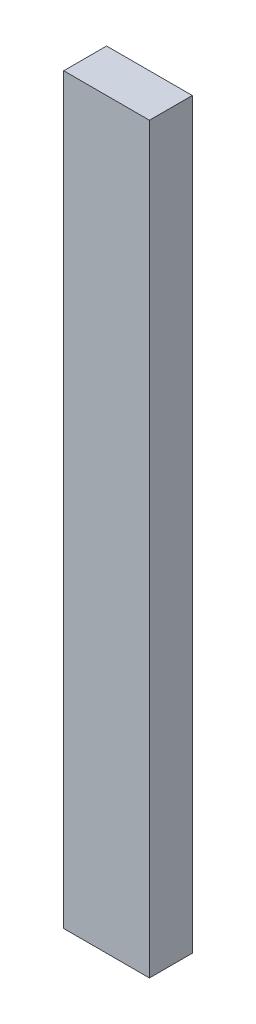
ISO-10303-21;
HEADER;
FILE_DESCRIPTION(('STEP AP214'),'2;1');
FILE_NAME('part.step','',(''),(''),'','','');
FILE_SCHEMA(('AUTOMOTIVE_DESIGN { 1 0 10303 214 1 1 1 1 }'));
ENDSEC;
DATA;
#1=APPLICATION_CONTEXT('core data for automotive mechanical design processes');
#2=APPLICATION_PROTOCOL_DEFINITION('international standard','automotive_design',2000,#1);
#3=PRODUCT_CONTEXT('',#1,'mechanical');
#4=PRODUCT('Part','Part','',(#3));
#5=PRODUCT_RELATED_PRODUCT_CATEGORY('part','',(#4));
#6=PRODUCT_DEFINITION_FORMATION('','',#4);
#7=PRODUCT_DEFINITION_CONTEXT('part definition',#1,'design');
#8=PRODUCT_DEFINITION('design','',#6,#7);
#9=PRODUCT_DEFINITION_SHAPE('','',#8);
#10=(LENGTH_UNIT() NAMED_UNIT(*) SI_UNIT(.MILLI.,.METRE.));
#11=(NAMED_UNIT(*) PLANE_ANGLE_UNIT() SI_UNIT($,.RADIAN.));
#12=(NAMED_UNIT(*) SI_UNIT($,.STERADIAN.) SOLID_ANGLE_UNIT());
#13=UNCERTAINTY_MEASURE_WITH_UNIT(LENGTH_MEASURE(1.E-05),#10,'distance_accuracy_value','');
#14=(GEOMETRIC_REPRESENTATION_CONTEXT(3) GLOBAL_UNCERTAINTY_ASSIGNED_CONTEXT((#13)) GLOBAL_UNIT_ASSIGNED_CONTEXT((#10,
#11,#12)) REPRESENTATION_CONTEXT('',''));
#15=CARTESIAN_POINT('',(0.,0.,0.));
#16=DIRECTION('',(0.,0.,1.));
#17=DIRECTION('',(1.,0.,0.));
#18=AXIS2_PLACEMENT_3D('',#15,#16,#17);
#19=CARTESIAN_POINT('',(-48.6470588235294,260.,-2.38235294117647));
#20=DIRECTION('',(1.,0.,0.));
#21=DIRECTION('',(0.,0.,-1.));
#22=AXIS2_PLACEMENT_3D('',#19,#20,#21);
#23=PLANE('',#22);
#24=DIRECTION('',(0.,0.,1.));
#25=VECTOR('',#24,1.);
#26=CARTESIAN_POINT('',(-48.6470588235294,0.,-2.38235294117647));
#27=LINE('',#26,#25);
#28=CARTESIAN_POINT('',(-48.6470588235294,0.,-2.38235294117647));
#29=VERTEX_POINT('',#28);
#30=CARTESIAN_POINT('',(-48.6470588235294,0.,12.6176470588235));
#31=VERTEX_POINT('',#30);
#32=EDGE_CURVE('E104',#29,#31,#27,.T.);
#33=ORIENTED_EDGE('',*,*,#32,.T.);
#34=DIRECTION('',(0.,-1.,0.));
#35=VECTOR('',#34,1.);
#36=CARTESIAN_POINT('',(-48.6470588235294,260.,12.6176470588235));
#37=LINE('',#36,#35);
#38=CARTESIAN_POINT('',(-48.6470588235294,260.,12.6176470588235));
#39=VERTEX_POINT('',#38);
#40=EDGE_CURVE('E11',#39,#31,#37,.T.);
#41=ORIENTED_EDGE('',*,*,#40,.F.);
#42=DIRECTION('',(0.,0.,1.));
#43=VECTOR('',#42,1.);
#44=CARTESIAN_POINT('',(-48.6470588235294,260.,-2.38235294117647));
#45=LINE('',#44,#43);
#46=CARTESIAN_POINT('',(-48.6470588235294,260.,-2.38235294117647));
#47=VERTEX_POINT('',#46);
#48=EDGE_CURVE('E92',#47,#39,#45,.T.);
#49=ORIENTED_EDGE('',*,*,#48,.F.);
#50=DIRECTION('',(0.,-1.,0.));
#51=VECTOR('',#50,1.);
#52=CARTESIAN_POINT('',(-48.6470588235294,260.,-2.38235294117647));
#53=LINE('',#52,#51);
#54=EDGE_CURVE('E100',#47,#29,#53,.T.);
#55=ORIENTED_EDGE('',*,*,#54,.T.);
#56=EDGE_LOOP('',(#33,#41,#49,#55));
#57=FACE_BOUND('',#56,.T.);
#58=ADVANCED_FACE('F41',(#57),#23,.F.);
#59=CARTESIAN_POINT('',(-48.6470588235294,260.,12.6176470588235));
#60=DIRECTION('',(0.,0.,-1.));
#61=DIRECTION('',(-1.,0.,0.));
#62=AXIS2_PLACEMENT_3D('',#59,#60,#61);
#63=PLANE('',#62);
#64=DIRECTION('',(1.,0.,0.));
#65=VECTOR('',#64,1.);
#66=CARTESIAN_POINT('',(-48.6470588235294,0.,12.6176470588235));
#67=LINE('',#66,#65);
#68=CARTESIAN_POINT('',(-18.6470588235294,0.,12.6176470588235));
#69=VERTEX_POINT('',#68);
#70=EDGE_CURVE('E96',#31,#69,#67,.T.);
#71=ORIENTED_EDGE('',*,*,#70,.T.);
#72=DIRECTION('',(0.,-1.,0.));
#73=VECTOR('',#72,1.);
#74=CARTESIAN_POINT('',(-18.6470588235294,260.,12.6176470588235));
#75=LINE('',#74,#73);
#76=CARTESIAN_POINT('',(-18.6470588235294,260.,12.6176470588235));
#77=VERTEX_POINT('',#76);
#78=EDGE_CURVE('E49',#77,#69,#75,.T.);
#79=ORIENTED_EDGE('',*,*,#78,.F.);
#80=DIRECTION('',(1.,0.,0.));
#81=VECTOR('',#80,1.);
#82=CARTESIAN_POINT('',(-48.6470588235294,260.,12.6176470588235));
#83=LINE('',#82,#81);
#84=EDGE_CURVE('E87',#39,#77,#83,.T.);
#85=ORIENTED_EDGE('',*,*,#84,.F.);
#86=ORIENTED_EDGE('',*,*,#40,.T.);
#87=EDGE_LOOP('',(#71,#79,#85,#86));
#88=FACE_BOUND('',#87,.T.);
#89=ADVANCED_FACE('F95',(#88),#63,.F.);
#90=CARTESIAN_POINT('',(-18.6470588235294,260.,-2.38235294117647));
#91=DIRECTION('',(-1.,0.,0.));
#92=DIRECTION('',(0.,0.,1.));
#93=AXIS2_PLACEMENT_3D('',#90,#91,#92);
#94=PLANE('',#93);
#95=DIRECTION('',(0.,0.,-1.));
#96=VECTOR('',#95,1.);
#97=CARTESIAN_POINT('',(-18.6470588235294,0.,-2.38235294117647));
#98=LINE('',#97,#96);
#99=CARTESIAN_POINT('',(-18.6470588235294,0.,-2.38235294117647));
#100=VERTEX_POINT('',#99);
#101=EDGE_CURVE('E74',#69,#100,#98,.T.);
#102=ORIENTED_EDGE('',*,*,#101,.T.);
#103=DIRECTION('',(0.,-1.,0.));
#104=VECTOR('',#103,1.);
#105=CARTESIAN_POINT('',(-18.6470588235294,260.,-2.38235294117647));
#106=LINE('',#105,#104);
#107=CARTESIAN_POINT('',(-18.6470588235294,260.,-2.38235294117647));
#108=VERTEX_POINT('',#107);
#109=EDGE_CURVE('E97',#108,#100,#106,.T.);
#110=ORIENTED_EDGE('',*,*,#109,.F.);
#111=DIRECTION('',(0.,0.,-1.));
#112=VECTOR('',#111,1.);
#113=CARTESIAN_POINT('',(-18.6470588235294,260.,-2.38235294117647));
#114=LINE('',#113,#112);
#115=EDGE_CURVE('E90',#77,#108,#114,.T.);
#116=ORIENTED_EDGE('',*,*,#115,.F.);
#117=ORIENTED_EDGE('',*,*,#78,.T.);
#118=EDGE_LOOP('',(#102,#110,#116,#117));
#119=FACE_BOUND('',#118,.T.);
#120=ADVANCED_FACE('F98',(#119),#94,.F.);
#121=CARTESIAN_POINT('',(-48.6470588235294,260.,-2.38235294117647));
#122=DIRECTION('',(0.,0.,1.));
#123=DIRECTION('',(1.,0.,0.));
#124=AXIS2_PLACEMENT_3D('',#121,#122,#123);
#125=PLANE('',#124);
#126=DIRECTION('',(-1.,0.,0.));
#127=VECTOR('',#126,1.);
#128=CARTESIAN_POINT('',(-48.6470588235294,0.,-2.38235294117647));
#129=LINE('',#128,#127);
#130=EDGE_CURVE('E80',#100,#29,#129,.T.);
#131=ORIENTED_EDGE('',*,*,#130,.T.);
#132=ORIENTED_EDGE('',*,*,#54,.F.);
#133=DIRECTION('',(-1.,0.,0.));
#134=VECTOR('',#133,1.);
#135=CARTESIAN_POINT('',(-48.6470588235294,260.,-2.38235294117647));
#136=LINE('',#135,#134);
#137=EDGE_CURVE('E57',#108,#47,#136,.T.);
#138=ORIENTED_EDGE('',*,*,#137,.F.);
#139=ORIENTED_EDGE('',*,*,#109,.T.);
#140=EDGE_LOOP('',(#131,#132,#138,#139));
#141=FACE_BOUND('',#140,.T.);
#142=ADVANCED_FACE('F111',(#141),#125,.F.);
#143=CARTESIAN_POINT('',(0.,260.,0.));
#144=DIRECTION('',(0.,1.,0.));
#145=DIRECTION('',(0.,0.,1.));
#146=AXIS2_PLACEMENT_3D('',#143,#144,#145);
#147=PLANE('',#146);
#148=ORIENTED_EDGE('',*,*,#48,.T.);
#149=ORIENTED_EDGE('',*,*,#84,.T.);
#150=ORIENTED_EDGE('',*,*,#115,.T.);
#151=ORIENTED_EDGE('',*,*,#137,.T.);
#152=EDGE_LOOP('',(#148,#149,#150,#151));
#153=FACE_BOUND('',#152,.T.);
#154=ADVANCED_FACE('F88',(#153),#147,.T.);
#155=CARTESIAN_POINT('',(0.,0.,0.));
#156=DIRECTION('',(0.,1.,0.));
#157=DIRECTION('',(0.,0.,1.));
#158=AXIS2_PLACEMENT_3D('',#155,#156,#157);
#159=PLANE('',#158);
#160=ORIENTED_EDGE('',*,*,#32,.F.);
#161=ORIENTED_EDGE('',*,*,#130,.F.);
#162=ORIENTED_EDGE('',*,*,#101,.F.);
#163=ORIENTED_EDGE('',*,*,#70,.F.);
#164=EDGE_LOOP('',(#160,#161,#162,#163));
#165=FACE_BOUND('',#164,.T.);
#166=ADVANCED_FACE('F114',(#165),#159,.F.);
#167=CLOSED_SHELL('',(#58,#89,#120,#142,#154,#166));
#168=MANIFOLD_SOLID_BREP('B2',#167);
#169=ADVANCED_BREP_SHAPE_REPRESENTATION('',(#18,#168),#14);
#170=SHAPE_DEFINITION_REPRESENTATION(#9,#169);
ENDSEC;
END-ISO-10303-21;
